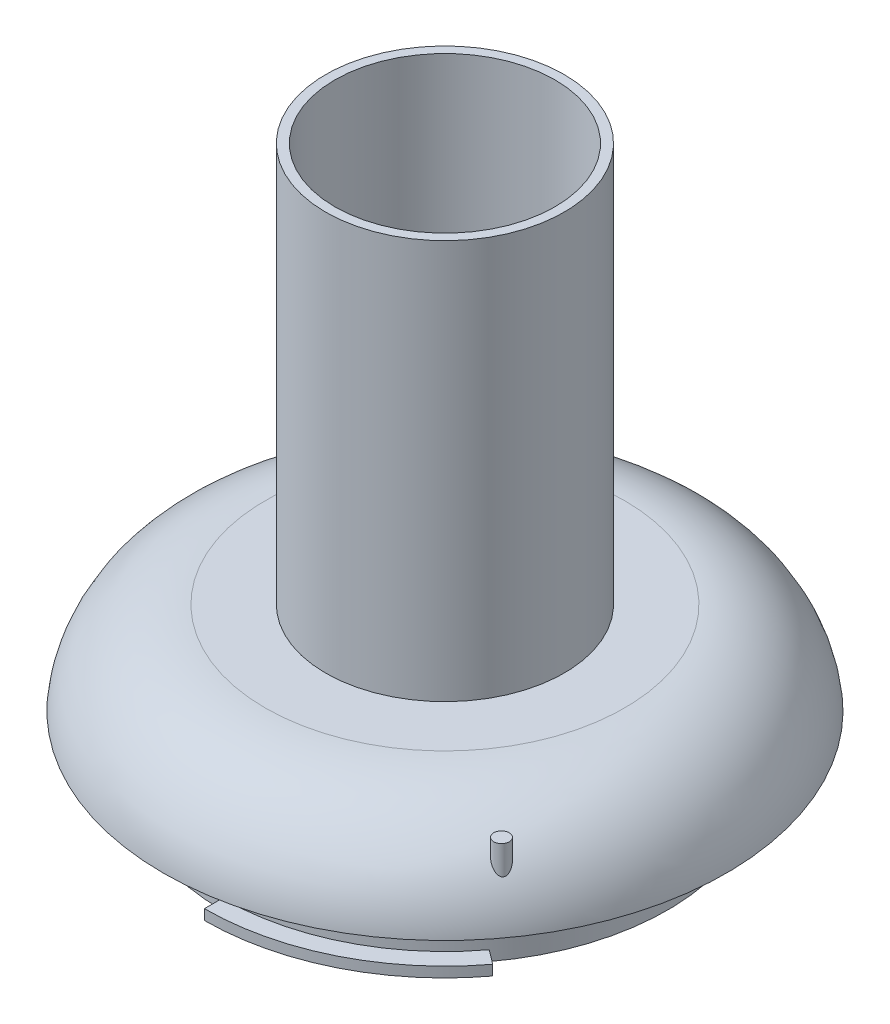
ISO-10303-21;
HEADER;
FILE_DESCRIPTION(('STEP AP214'),'2;1');
FILE_NAME('part.step','',(''),(''),'','','');
FILE_SCHEMA(('AUTOMOTIVE_DESIGN { 1 0 10303 214 1 1 1 1 }'));
ENDSEC;
DATA;
#1=APPLICATION_CONTEXT('core data for automotive mechanical design processes');
#2=APPLICATION_PROTOCOL_DEFINITION('international standard','automotive_design',2000,#1);
#3=PRODUCT_CONTEXT('',#1,'mechanical');
#4=PRODUCT('Part','Part','',(#3));
#5=PRODUCT_RELATED_PRODUCT_CATEGORY('part','',(#4));
#6=PRODUCT_DEFINITION_FORMATION('','',#4);
#7=PRODUCT_DEFINITION_CONTEXT('part definition',#1,'design');
#8=PRODUCT_DEFINITION('design','',#6,#7);
#9=PRODUCT_DEFINITION_SHAPE('','',#8);
#10=(LENGTH_UNIT() NAMED_UNIT(*) SI_UNIT(.MILLI.,.METRE.));
#11=(NAMED_UNIT(*) PLANE_ANGLE_UNIT() SI_UNIT($,.RADIAN.));
#12=(NAMED_UNIT(*) SI_UNIT($,.STERADIAN.) SOLID_ANGLE_UNIT());
#13=UNCERTAINTY_MEASURE_WITH_UNIT(LENGTH_MEASURE(1.E-05),#10,'distance_accuracy_value','');
#14=(GEOMETRIC_REPRESENTATION_CONTEXT(3) GLOBAL_UNCERTAINTY_ASSIGNED_CONTEXT((#13)) GLOBAL_UNIT_ASSIGNED_CONTEXT((#10,
#11,#12)) REPRESENTATION_CONTEXT('',''));
#15=CARTESIAN_POINT('',(0.,0.,0.));
#16=DIRECTION('',(0.,0.,1.));
#17=DIRECTION('',(1.,0.,0.));
#18=AXIS2_PLACEMENT_3D('',#15,#16,#17);
#19=CARTESIAN_POINT('',(0.,0.,0.));
#20=DIRECTION('',(0.,1.,0.));
#21=DIRECTION('',(0.,0.,1.));
#22=AXIS2_PLACEMENT_3D('',#19,#20,#21);
#23=PLANE('',#22);
#24=CARTESIAN_POINT('',(0.,0.,0.));
#25=DIRECTION('',(0.,1.,0.));
#26=DIRECTION('',(0.,0.,1.));
#27=AXIS2_PLACEMENT_3D('',#24,#25,#26);
#28=CIRCLE('',#27,21.75);
#29=CARTESIAN_POINT('',(17.388173548237,0.,13.0657537347216));
#30=VERTEX_POINT('',#29);
#31=CARTESIAN_POINT('',(18.8360525323115,0.,-10.8750000000001));
#32=VERTEX_POINT('',#31);
#33=EDGE_CURVE('E244',#30,#32,#28,.T.);
#34=ORIENTED_EDGE('',*,*,#33,.F.);
#35=DIRECTION('',(0.799456255091356,0.,0.600724309642372));
#36=VECTOR('',#35,1.);
#37=CARTESIAN_POINT('',(17.388173548237,0.,13.0657537347216));
#38=LINE('',#37,#36);
#39=CARTESIAN_POINT('',(18.7872219946469,0.,14.1170212765957));
#40=VERTEX_POINT('',#39);
#41=EDGE_CURVE('E182',#30,#40,#38,.T.);
#42=ORIENTED_EDGE('',*,*,#41,.T.);
#43=CARTESIAN_POINT('',(0.,0.,0.));
#44=DIRECTION('',(0.,-1.,0.));
#45=DIRECTION('',(0.,0.,-1.));
#46=AXIS2_PLACEMENT_3D('',#43,#44,#45);
#47=CIRCLE('',#46,23.5);
#48=CARTESIAN_POINT('',(0.,0.,23.5));
#49=VERTEX_POINT('',#48);
#50=EDGE_CURVE('E204',#40,#49,#47,.T.);
#51=ORIENTED_EDGE('',*,*,#50,.T.);
#52=DIRECTION('',(0.,0.,1.));
#53=VECTOR('',#52,1.);
#54=CARTESIAN_POINT('',(0.,0.,21.75));
#55=LINE('',#54,#53);
#56=CARTESIAN_POINT('',(0.,0.,21.75));
#57=VERTEX_POINT('',#56);
#58=EDGE_CURVE('E193',#57,#49,#55,.T.);
#59=ORIENTED_EDGE('',*,*,#58,.F.);
#60=CARTESIAN_POINT('',(-20.0093614279787,0.,8.52572315082523));
#61=VERTEX_POINT('',#60);
#62=EDGE_CURVE('E239',#61,#57,#28,.T.);
#63=ORIENTED_EDGE('',*,*,#62,.F.);
#64=DIRECTION('',(-0.919970640366838,0.,0.391987271302309));
#65=VECTOR('',#64,1.);
#66=CARTESIAN_POINT('',(-20.0093614279787,0.,8.52572315082523));
#67=LINE('',#66,#65);
#68=CARTESIAN_POINT('',(-21.6193100486207,0.,9.21170087560427));
#69=VERTEX_POINT('',#68);
#70=EDGE_CURVE('E152',#61,#69,#67,.T.);
#71=ORIENTED_EDGE('',*,*,#70,.T.);
#72=CARTESIAN_POINT('',(0.,0.,0.));
#73=DIRECTION('',(0.,-1.,0.));
#74=DIRECTION('',(0.866025403784443,0.,0.499999999999992));
#75=AXIS2_PLACEMENT_3D('',#72,#73,#74);
#76=CIRCLE('',#75,23.5);
#77=CARTESIAN_POINT('',(-20.3515969889344,0.,-11.7499999999998));
#78=VERTEX_POINT('',#77);
#79=EDGE_CURVE('E126',#69,#78,#76,.T.);
#80=ORIENTED_EDGE('',*,*,#79,.T.);
#81=DIRECTION('',(-0.866025403784443,0.,-0.499999999999992));
#82=VECTOR('',#81,1.);
#83=CARTESIAN_POINT('',(-18.8360525323116,0.,-10.8749999999998));
#84=LINE('',#83,#82);
#85=CARTESIAN_POINT('',(-18.8360525323116,0.,-10.8749999999998));
#86=VERTEX_POINT('',#85);
#87=EDGE_CURVE('E143',#86,#78,#84,.T.);
#88=ORIENTED_EDGE('',*,*,#87,.F.);
#89=CARTESIAN_POINT('',(2.62118787974171,0.,-21.5914768855467));
#90=VERTEX_POINT('',#89);
#91=EDGE_CURVE('E246',#90,#86,#28,.T.);
#92=ORIENTED_EDGE('',*,*,#91,.F.);
#93=DIRECTION('',(0.120514385275481,0.,-0.992711580944674));
#94=VECTOR('',#93,1.);
#95=CARTESIAN_POINT('',(2.62118787974171,0.,-21.5914768855467));
#96=LINE('',#95,#94);
#97=CARTESIAN_POINT('',(2.8320880539738,0.,-23.3287221521998));
#98=VERTEX_POINT('',#97);
#99=EDGE_CURVE('E156',#90,#98,#96,.T.);
#100=ORIENTED_EDGE('',*,*,#99,.T.);
#101=CARTESIAN_POINT('',(0.,0.,0.));
#102=DIRECTION('',(0.,-1.,0.));
#103=DIRECTION('',(-0.866025403784436,0.,0.500000000000004));
#104=AXIS2_PLACEMENT_3D('',#101,#102,#103);
#105=CIRCLE('',#104,23.5);
#106=CARTESIAN_POINT('',(20.3515969889343,0.,-11.7500000000001));
#107=VERTEX_POINT('',#106);
#108=EDGE_CURVE('E174',#98,#107,#105,.T.);
#109=ORIENTED_EDGE('',*,*,#108,.T.);
#110=DIRECTION('',(0.866025403784436,0.,-0.500000000000004));
#111=VECTOR('',#110,1.);
#112=CARTESIAN_POINT('',(18.8360525323115,0.,-10.8750000000001));
#113=LINE('',#112,#111);
#114=EDGE_CURVE('E163',#32,#107,#113,.T.);
#115=ORIENTED_EDGE('',*,*,#114,.F.);
#116=EDGE_LOOP('',(#34,#42,#51,#59,#63,#71,#80,#88,#92,#100,#109,#115));
#117=FACE_BOUND('',#116,.T.);
#118=CARTESIAN_POINT('',(0.,0.,0.));
#119=DIRECTION('',(0.,-1.,0.));
#120=DIRECTION('',(0.,0.,-1.));
#121=AXIS2_PLACEMENT_3D('',#118,#119,#120);
#122=CIRCLE('',#121,20.);
#123=CARTESIAN_POINT('',(0.,0.,-20.));
#124=VERTEX_POINT('',#123);
#125=EDGE_CURVE('E212',#124,#124,#122,.T.);
#126=ORIENTED_EDGE('',*,*,#125,.F.);
#127=EDGE_LOOP('',(#126));
#128=FACE_BOUND('',#127,.T.);
#129=ADVANCED_FACE('F33',(#117,#128),#23,.F.);
#130=CARTESIAN_POINT('',(0.,5.,0.));
#131=DIRECTION('',(0.,-1.,0.));
#132=DIRECTION('',(0.,0.,-1.));
#133=AXIS2_PLACEMENT_3D('',#130,#131,#132);
#134=CYLINDRICAL_SURFACE('',#133,21.75);
#135=CARTESIAN_POINT('',(0.,1.,0.));
#136=DIRECTION('',(0.,-1.,0.));
#137=DIRECTION('',(0.866025403784443,0.,0.499999999999992));
#138=AXIS2_PLACEMENT_3D('',#135,#136,#137);
#139=CIRCLE('',#138,21.75);
#140=CARTESIAN_POINT('',(-20.0093614279787,1.,8.52572315082523));
#141=VERTEX_POINT('',#140);
#142=CARTESIAN_POINT('',(-18.8360525323116,1.,-10.8749999999998));
#143=VERTEX_POINT('',#142);
#144=EDGE_CURVE('E52',#141,#143,#139,.T.);
#145=ORIENTED_EDGE('',*,*,#144,.F.);
#146=DIRECTION('',(0.,-1.,0.));
#147=VECTOR('',#146,1.);
#148=CARTESIAN_POINT('',(-20.0093614279787,1.,8.52572315082523));
#149=LINE('',#148,#147);
#150=EDGE_CURVE('E142',#141,#61,#149,.T.);
#151=ORIENTED_EDGE('',*,*,#150,.T.);
#152=ORIENTED_EDGE('',*,*,#62,.T.);
#153=DIRECTION('',(0.,-1.,0.));
#154=VECTOR('',#153,1.);
#155=CARTESIAN_POINT('',(0.,1.,21.75));
#156=LINE('',#155,#154);
#157=CARTESIAN_POINT('',(0.,1.,21.75));
#158=VERTEX_POINT('',#157);
#159=EDGE_CURVE('E213',#158,#57,#156,.T.);
#160=ORIENTED_EDGE('',*,*,#159,.F.);
#161=CARTESIAN_POINT('',(0.,1.,0.));
#162=DIRECTION('',(0.,-1.,0.));
#163=DIRECTION('',(0.,0.,-1.));
#164=AXIS2_PLACEMENT_3D('',#161,#162,#163);
#165=CIRCLE('',#164,21.75);
#166=CARTESIAN_POINT('',(17.388173548237,1.,13.0657537347216));
#167=VERTEX_POINT('',#166);
#168=EDGE_CURVE('E198',#167,#158,#165,.T.);
#169=ORIENTED_EDGE('',*,*,#168,.F.);
#170=DIRECTION('',(0.,-1.,0.));
#171=VECTOR('',#170,1.);
#172=CARTESIAN_POINT('',(17.388173548237,1.,13.0657537347216));
#173=LINE('',#172,#171);
#174=EDGE_CURVE('E209',#167,#30,#173,.T.);
#175=ORIENTED_EDGE('',*,*,#174,.T.);
#176=ORIENTED_EDGE('',*,*,#33,.T.);
#177=DIRECTION('',(0.,-1.,0.));
#178=VECTOR('',#177,1.);
#179=CARTESIAN_POINT('',(18.8360525323115,1.,-10.8750000000001));
#180=LINE('',#179,#178);
#181=CARTESIAN_POINT('',(18.8360525323115,1.,-10.8750000000001));
#182=VERTEX_POINT('',#181);
#183=EDGE_CURVE('E183',#182,#32,#180,.T.);
#184=ORIENTED_EDGE('',*,*,#183,.F.);
#185=CARTESIAN_POINT('',(0.,1.,0.));
#186=DIRECTION('',(0.,-1.,0.));
#187=DIRECTION('',(-0.866025403784436,0.,0.500000000000004));
#188=AXIS2_PLACEMENT_3D('',#185,#186,#187);
#189=CIRCLE('',#188,21.75);
#190=CARTESIAN_POINT('',(2.62118787974171,1.,-21.5914768855466));
#191=VERTEX_POINT('',#190);
#192=EDGE_CURVE('E168',#191,#182,#189,.T.);
#193=ORIENTED_EDGE('',*,*,#192,.F.);
#194=DIRECTION('',(0.,-1.,0.));
#195=VECTOR('',#194,1.);
#196=CARTESIAN_POINT('',(2.62118787974171,1.,-21.5914768855467));
#197=LINE('',#196,#195);
#198=EDGE_CURVE('E179',#191,#90,#197,.T.);
#199=ORIENTED_EDGE('',*,*,#198,.T.);
#200=ORIENTED_EDGE('',*,*,#91,.T.);
#201=DIRECTION('',(0.,-1.,0.));
#202=VECTOR('',#201,1.);
#203=CARTESIAN_POINT('',(-18.8360525323116,1.,-10.8749999999998));
#204=LINE('',#203,#202);
#205=EDGE_CURVE('E48',#143,#86,#204,.T.);
#206=ORIENTED_EDGE('',*,*,#205,.F.);
#207=EDGE_LOOP('',(#145,#151,#152,#160,#169,#175,#176,#184,#193,#199,#200,#206));
#208=FACE_BOUND('',#207,.T.);
#209=CARTESIAN_POINT('',(0.,5.,0.));
#210=DIRECTION('',(0.,1.,0.));
#211=DIRECTION('',(0.,0.,1.));
#212=AXIS2_PLACEMENT_3D('',#209,#210,#211);
#213=CIRCLE('',#212,21.75);
#214=CARTESIAN_POINT('',(0.,5.,21.75));
#215=VERTEX_POINT('',#214);
#216=EDGE_CURVE('E240',#215,#215,#213,.T.);
#217=ORIENTED_EDGE('',*,*,#216,.F.);
#218=EDGE_LOOP('',(#217));
#219=FACE_BOUND('',#218,.T.);
#220=ADVANCED_FACE('F331',(#208,#219),#134,.T.);
#221=CARTESIAN_POINT('',(0.,5.,0.));
#222=DIRECTION('',(0.,1.,0.));
#223=DIRECTION('',(0.,0.,1.));
#224=AXIS2_PLACEMENT_3D('',#221,#222,#223);
#225=PLANE('',#224);
#226=CARTESIAN_POINT('',(0.,5.,0.));
#227=DIRECTION('',(0.,1.,0.));
#228=DIRECTION('',(0.,0.,1.));
#229=AXIS2_PLACEMENT_3D('',#226,#227,#228);
#230=CIRCLE('',#229,23.5);
#231=CARTESIAN_POINT('',(0.,5.,23.5));
#232=VERTEX_POINT('',#231);
#233=EDGE_CURVE('E236',#232,#232,#230,.T.);
#234=ORIENTED_EDGE('',*,*,#233,.F.);
#235=EDGE_LOOP('',(#234));
#236=FACE_BOUND('',#235,.T.);
#237=ORIENTED_EDGE('',*,*,#216,.T.);
#238=EDGE_LOOP('',(#237));
#239=FACE_BOUND('',#238,.T.);
#240=ADVANCED_FACE('F327',(#236,#239),#225,.F.);
#241=CARTESIAN_POINT('',(0.,6.,0.));
#242=DIRECTION('',(0.,1.,0.));
#243=DIRECTION('',(0.,0.,1.));
#244=AXIS2_PLACEMENT_3D('',#241,#242,#243);
#245=PLANE('',#244);
#246=CARTESIAN_POINT('',(0.,6.,0.));
#247=DIRECTION('',(0.,1.,0.));
#248=DIRECTION('',(0.,0.,1.));
#249=AXIS2_PLACEMENT_3D('',#246,#247,#248);
#250=CIRCLE('',#249,25.9750868534163);
#251=CARTESIAN_POINT('',(0.,6.,25.9750868534163));
#252=VERTEX_POINT('',#251);
#253=EDGE_CURVE('E11',#252,#252,#250,.T.);
#254=ORIENTED_EDGE('',*,*,#253,.T.);
#255=EDGE_LOOP('',(#254));
#256=FACE_BOUND('',#255,.T.);
#257=CARTESIAN_POINT('',(0.,6.,0.));
#258=DIRECTION('',(0.,1.,0.));
#259=DIRECTION('',(0.,0.,1.));
#260=AXIS2_PLACEMENT_3D('',#257,#258,#259);
#261=CIRCLE('',#260,27.5);
#262=CARTESIAN_POINT('',(0.,6.,27.5));
#263=VERTEX_POINT('',#262);
#264=EDGE_CURVE('E233',#263,#263,#261,.T.);
#265=ORIENTED_EDGE('',*,*,#264,.F.);
#266=EDGE_LOOP('',(#265));
#267=FACE_BOUND('',#266,.T.);
#268=ADVANCED_FACE('F323',(#256,#267),#245,.F.);
#269=CARTESIAN_POINT('',(0.,15.,0.));
#270=DIRECTION('',(0.,1.,0.));
#271=DIRECTION('',(0.,0.,1.));
#272=AXIS2_PLACEMENT_3D('',#269,#270,#271);
#273=PLANE('',#272);
#274=CARTESIAN_POINT('',(0.,15.,0.));
#275=DIRECTION('',(0.,1.,0.));
#276=DIRECTION('',(0.,0.,1.));
#277=AXIS2_PLACEMENT_3D('',#274,#275,#276);
#278=CIRCLE('',#277,17.5501256289338);
#279=CARTESIAN_POINT('',(0.,15.,17.5501256289338));
#280=VERTEX_POINT('',#279);
#281=EDGE_CURVE('E243',#280,#280,#278,.T.);
#282=ORIENTED_EDGE('',*,*,#281,.T.);
#283=EDGE_LOOP('',(#282));
#284=FACE_BOUND('',#283,.T.);
#285=CARTESIAN_POINT('',(0.,15.,0.));
#286=DIRECTION('',(0.,1.,0.));
#287=DIRECTION('',(0.,0.,1.));
#288=AXIS2_PLACEMENT_3D('',#285,#286,#287);
#289=CIRCLE('',#288,11.65);
#290=CARTESIAN_POINT('',(0.,15.,11.65));
#291=VERTEX_POINT('',#290);
#292=EDGE_CURVE('E230',#291,#291,#289,.T.);
#293=ORIENTED_EDGE('',*,*,#292,.F.);
#294=EDGE_LOOP('',(#293));
#295=FACE_BOUND('',#294,.T.);
#296=ADVANCED_FACE('F316',(#284,#295),#273,.T.);
#297=CARTESIAN_POINT('',(0.,54.,0.));
#298=DIRECTION('',(0.,1.,0.));
#299=DIRECTION('',(0.,0.,1.));
#300=AXIS2_PLACEMENT_3D('',#297,#298,#299);
#301=PLANE('',#300);
#302=CARTESIAN_POINT('',(0.,54.,0.));
#303=DIRECTION('',(0.,1.,0.));
#304=DIRECTION('',(0.,0.,1.));
#305=AXIS2_PLACEMENT_3D('',#302,#303,#304);
#306=CIRCLE('',#305,11.65);
#307=CARTESIAN_POINT('',(0.,54.,11.65));
#308=VERTEX_POINT('',#307);
#309=EDGE_CURVE('E225',#308,#308,#306,.T.);
#310=ORIENTED_EDGE('',*,*,#309,.T.);
#311=EDGE_LOOP('',(#310));
#312=FACE_BOUND('',#311,.T.);
#313=CARTESIAN_POINT('',(0.,54.,0.));
#314=DIRECTION('',(0.,1.,0.));
#315=DIRECTION('',(0.,0.,1.));
#316=AXIS2_PLACEMENT_3D('',#313,#314,#315);
#317=CIRCLE('',#316,10.75);
#318=CARTESIAN_POINT('',(0.,54.,10.75));
#319=VERTEX_POINT('',#318);
#320=EDGE_CURVE('E222',#319,#319,#317,.T.);
#321=ORIENTED_EDGE('',*,*,#320,.F.);
#322=EDGE_LOOP('',(#321));
#323=FACE_BOUND('',#322,.T.);
#324=ADVANCED_FACE('F313',(#312,#323),#301,.T.);
#325=CARTESIAN_POINT('',(0.,54.,0.));
#326=DIRECTION('',(0.,-1.,0.));
#327=DIRECTION('',(0.,0.,-1.));
#328=AXIS2_PLACEMENT_3D('',#325,#326,#327);
#329=CYLINDRICAL_SURFACE('',#328,11.65);
#330=ORIENTED_EDGE('',*,*,#292,.T.);
#331=EDGE_LOOP('',(#330));
#332=FACE_BOUND('',#331,.T.);
#333=ORIENTED_EDGE('',*,*,#309,.F.);
#334=EDGE_LOOP('',(#333));
#335=FACE_BOUND('',#334,.T.);
#336=ADVANCED_FACE('F311',(#332,#335),#329,.T.);
#337=CARTESIAN_POINT('',(0.,54.,0.));
#338=DIRECTION('',(0.,-1.,0.));
#339=DIRECTION('',(0.,0.,-1.));
#340=AXIS2_PLACEMENT_3D('',#337,#338,#339);
#341=CYLINDRICAL_SURFACE('',#340,10.75);
#342=ORIENTED_EDGE('',*,*,#320,.T.);
#343=EDGE_LOOP('',(#342));
#344=FACE_BOUND('',#343,.T.);
#345=CARTESIAN_POINT('',(0.,14.,0.));
#346=DIRECTION('',(0.,1.,0.));
#347=DIRECTION('',(0.,0.,1.));
#348=AXIS2_PLACEMENT_3D('',#345,#346,#347);
#349=CIRCLE('',#348,10.75);
#350=CARTESIAN_POINT('',(0.,14.,10.75));
#351=VERTEX_POINT('',#350);
#352=EDGE_CURVE('E221',#351,#351,#349,.T.);
#353=ORIENTED_EDGE('',*,*,#352,.F.);
#354=EDGE_LOOP('',(#353));
#355=FACE_BOUND('',#354,.T.);
#356=ADVANCED_FACE('F307',(#344,#355),#341,.F.);
#357=CARTESIAN_POINT('',(0.,14.,0.));
#358=DIRECTION('',(0.,-1.,0.));
#359=DIRECTION('',(0.,0.,-1.));
#360=AXIS2_PLACEMENT_3D('',#357,#358,#359);
#361=CONICAL_SURFACE('',#360,10.75,0.583870395662115);
#362=ORIENTED_EDGE('',*,*,#125,.T.);
#363=EDGE_LOOP('',(#362));
#364=FACE_BOUND('',#363,.T.);
#365=ORIENTED_EDGE('',*,*,#352,.T.);
#366=EDGE_LOOP('',(#365));
#367=FACE_BOUND('',#366,.T.);
#368=ADVANCED_FACE('F303',(#364,#367),#361,.F.);
#369=CARTESIAN_POINT('',(17.388173548237,1.,13.0657537347216));
#370=DIRECTION('',(0.600724309642372,0.,-0.799456255091356));
#371=DIRECTION('',(-0.799456255091356,0.,-0.600724309642372));
#372=AXIS2_PLACEMENT_3D('',#369,#370,#371);
#373=PLANE('',#372);
#374=ORIENTED_EDGE('',*,*,#41,.F.);
#375=ORIENTED_EDGE('',*,*,#174,.F.);
#376=DIRECTION('',(0.799456255091356,0.,0.600724309642372));
#377=VECTOR('',#376,1.);
#378=CARTESIAN_POINT('',(17.388173548237,1.,13.0657537347216));
#379=LINE('',#378,#377);
#380=CARTESIAN_POINT('',(18.7872219946469,1.,14.1170212765957));
#381=VERTEX_POINT('',#380);
#382=EDGE_CURVE('E189',#167,#381,#379,.T.);
#383=ORIENTED_EDGE('',*,*,#382,.T.);
#384=DIRECTION('',(0.,-1.,0.));
#385=VECTOR('',#384,1.);
#386=CARTESIAN_POINT('',(18.7872219946469,1.,14.1170212765957));
#387=LINE('',#386,#385);
#388=EDGE_CURVE('E201',#381,#40,#387,.T.);
#389=ORIENTED_EDGE('',*,*,#388,.T.);
#390=EDGE_LOOP('',(#374,#375,#383,#389));
#391=FACE_BOUND('',#390,.T.);
#392=ADVANCED_FACE('F296',(#391),#373,.T.);
#393=CARTESIAN_POINT('',(0.,1.,21.75));
#394=DIRECTION('',(1.,0.,0.));
#395=DIRECTION('',(0.,0.,-1.));
#396=AXIS2_PLACEMENT_3D('',#393,#394,#395);
#397=PLANE('',#396);
#398=ORIENTED_EDGE('',*,*,#58,.T.);
#399=DIRECTION('',(0.,-1.,0.));
#400=VECTOR('',#399,1.);
#401=CARTESIAN_POINT('',(0.,1.,23.5));
#402=LINE('',#401,#400);
#403=CARTESIAN_POINT('',(0.,1.,23.5));
#404=VERTEX_POINT('',#403);
#405=EDGE_CURVE('E216',#404,#49,#402,.T.);
#406=ORIENTED_EDGE('',*,*,#405,.F.);
#407=DIRECTION('',(0.,0.,1.));
#408=VECTOR('',#407,1.);
#409=CARTESIAN_POINT('',(0.,1.,21.75));
#410=LINE('',#409,#408);
#411=EDGE_CURVE('E196',#158,#404,#410,.T.);
#412=ORIENTED_EDGE('',*,*,#411,.F.);
#413=ORIENTED_EDGE('',*,*,#159,.T.);
#414=EDGE_LOOP('',(#398,#406,#412,#413));
#415=FACE_BOUND('',#414,.T.);
#416=ADVANCED_FACE('F293',(#415),#397,.F.);
#417=CARTESIAN_POINT('',(0.,1.,0.));
#418=DIRECTION('',(0.,-1.,0.));
#419=DIRECTION('',(0.,0.,-1.));
#420=AXIS2_PLACEMENT_3D('',#417,#418,#419);
#421=CYLINDRICAL_SURFACE('',#420,23.5);
#422=ORIENTED_EDGE('',*,*,#50,.F.);
#423=ORIENTED_EDGE('',*,*,#388,.F.);
#424=CARTESIAN_POINT('',(0.,1.,0.));
#425=DIRECTION('',(0.,-1.,0.));
#426=DIRECTION('',(0.,0.,-1.));
#427=AXIS2_PLACEMENT_3D('',#424,#425,#426);
#428=CIRCLE('',#427,23.5);
#429=EDGE_CURVE('E192',#381,#404,#428,.T.);
#430=ORIENTED_EDGE('',*,*,#429,.T.);
#431=ORIENTED_EDGE('',*,*,#405,.T.);
#432=EDGE_LOOP('',(#422,#423,#430,#431));
#433=FACE_BOUND('',#432,.T.);
#434=ADVANCED_FACE('F291',(#433),#421,.T.);
#435=CARTESIAN_POINT('',(0.,1.,0.));
#436=DIRECTION('',(0.,-1.,0.));
#437=DIRECTION('',(0.,0.,-1.));
#438=AXIS2_PLACEMENT_3D('',#435,#436,#437);
#439=PLANE('',#438);
#440=ORIENTED_EDGE('',*,*,#382,.F.);
#441=ORIENTED_EDGE('',*,*,#168,.T.);
#442=ORIENTED_EDGE('',*,*,#411,.T.);
#443=ORIENTED_EDGE('',*,*,#429,.F.);
#444=EDGE_LOOP('',(#440,#441,#442,#443));
#445=FACE_BOUND('',#444,.T.);
#446=ADVANCED_FACE('F287',(#445),#439,.F.);
#447=CARTESIAN_POINT('',(2.62118787974171,1.,-21.5914768855467));
#448=DIRECTION('',(-0.992711580944673,0.,-0.120514385275481));
#449=DIRECTION('',(-0.120514385275481,0.,0.992711580944673));
#450=AXIS2_PLACEMENT_3D('',#447,#448,#449);
#451=PLANE('',#450);
#452=ORIENTED_EDGE('',*,*,#99,.F.);
#453=ORIENTED_EDGE('',*,*,#198,.F.);
#454=DIRECTION('',(0.120514385275481,0.,-0.992711580944674));
#455=VECTOR('',#454,1.);
#456=CARTESIAN_POINT('',(2.62118787974171,1.,-21.5914768855467));
#457=LINE('',#456,#455);
#458=CARTESIAN_POINT('',(2.8320880539738,1.,-23.3287221521998));
#459=VERTEX_POINT('',#458);
#460=EDGE_CURVE('E159',#191,#459,#457,.T.);
#461=ORIENTED_EDGE('',*,*,#460,.T.);
#462=DIRECTION('',(0.,-1.,0.));
#463=VECTOR('',#462,1.);
#464=CARTESIAN_POINT('',(2.8320880539738,1.,-23.3287221521998));
#465=LINE('',#464,#463);
#466=EDGE_CURVE('E171',#459,#98,#465,.T.);
#467=ORIENTED_EDGE('',*,*,#466,.T.);
#468=EDGE_LOOP('',(#452,#453,#461,#467));
#469=FACE_BOUND('',#468,.T.);
#470=ADVANCED_FACE('F280',(#469),#451,.T.);
#471=CARTESIAN_POINT('',(18.8360525323115,1.,-10.8750000000001));
#472=DIRECTION('',(-0.500000000000004,0.,-0.866025403784436));
#473=DIRECTION('',(-0.866025403784436,0.,0.500000000000004));
#474=AXIS2_PLACEMENT_3D('',#471,#472,#473);
#475=PLANE('',#474);
#476=ORIENTED_EDGE('',*,*,#114,.T.);
#477=DIRECTION('',(0.,-1.,0.));
#478=VECTOR('',#477,1.);
#479=CARTESIAN_POINT('',(20.3515969889343,1.,-11.7500000000001));
#480=LINE('',#479,#478);
#481=CARTESIAN_POINT('',(20.3515969889343,1.,-11.7500000000001));
#482=VERTEX_POINT('',#481);
#483=EDGE_CURVE('E186',#482,#107,#480,.T.);
#484=ORIENTED_EDGE('',*,*,#483,.F.);
#485=DIRECTION('',(0.866025403784436,0.,-0.500000000000004));
#486=VECTOR('',#485,1.);
#487=CARTESIAN_POINT('',(18.8360525323115,1.,-10.8750000000001));
#488=LINE('',#487,#486);
#489=EDGE_CURVE('E166',#182,#482,#488,.T.);
#490=ORIENTED_EDGE('',*,*,#489,.F.);
#491=ORIENTED_EDGE('',*,*,#183,.T.);
#492=EDGE_LOOP('',(#476,#484,#490,#491));
#493=FACE_BOUND('',#492,.T.);
#494=ADVANCED_FACE('F277',(#493),#475,.F.);
#495=CARTESIAN_POINT('',(0.,1.,0.));
#496=DIRECTION('',(0.,-1.,0.));
#497=DIRECTION('',(0.,0.,-1.));
#498=AXIS2_PLACEMENT_3D('',#495,#496,#497);
#499=CYLINDRICAL_SURFACE('',#498,23.5);
#500=ORIENTED_EDGE('',*,*,#108,.F.);
#501=ORIENTED_EDGE('',*,*,#466,.F.);
#502=CARTESIAN_POINT('',(0.,1.,0.));
#503=DIRECTION('',(0.,-1.,0.));
#504=DIRECTION('',(-0.866025403784436,0.,0.500000000000004));
#505=AXIS2_PLACEMENT_3D('',#502,#503,#504);
#506=CIRCLE('',#505,23.5);
#507=EDGE_CURVE('E162',#459,#482,#506,.T.);
#508=ORIENTED_EDGE('',*,*,#507,.T.);
#509=ORIENTED_EDGE('',*,*,#483,.T.);
#510=EDGE_LOOP('',(#500,#501,#508,#509));
#511=FACE_BOUND('',#510,.T.);
#512=ADVANCED_FACE('F275',(#511),#499,.T.);
#513=CARTESIAN_POINT('',(0.,1.,0.));
#514=DIRECTION('',(0.,-1.,0.));
#515=DIRECTION('',(-0.866025403784436,0.,0.500000000000004));
#516=AXIS2_PLACEMENT_3D('',#513,#514,#515);
#517=PLANE('',#516);
#518=ORIENTED_EDGE('',*,*,#460,.F.);
#519=ORIENTED_EDGE('',*,*,#192,.T.);
#520=ORIENTED_EDGE('',*,*,#489,.T.);
#521=ORIENTED_EDGE('',*,*,#507,.F.);
#522=EDGE_LOOP('',(#518,#519,#520,#521));
#523=FACE_BOUND('',#522,.T.);
#524=ADVANCED_FACE('F272',(#523),#517,.F.);
#525=CARTESIAN_POINT('',(-20.0093614279787,1.,8.52572315082523));
#526=DIRECTION('',(0.391987271302309,0.,0.919970640366838));
#527=DIRECTION('',(0.919970640366838,0.,-0.391987271302309));
#528=AXIS2_PLACEMENT_3D('',#525,#526,#527);
#529=PLANE('',#528);
#530=ORIENTED_EDGE('',*,*,#70,.F.);
#531=ORIENTED_EDGE('',*,*,#150,.F.);
#532=DIRECTION('',(-0.919970640366838,0.,0.391987271302309));
#533=VECTOR('',#532,1.);
#534=CARTESIAN_POINT('',(-20.0093614279787,1.,8.52572315082523));
#535=LINE('',#534,#533);
#536=CARTESIAN_POINT('',(-21.6193100486207,1.,9.21170087560427));
#537=VERTEX_POINT('',#536);
#538=EDGE_CURVE('E136',#141,#537,#535,.T.);
#539=ORIENTED_EDGE('',*,*,#538,.T.);
#540=DIRECTION('',(0.,-1.,0.));
#541=VECTOR('',#540,1.);
#542=CARTESIAN_POINT('',(-21.6193100486207,1.,9.21170087560427));
#543=LINE('',#542,#541);
#544=EDGE_CURVE('E121',#537,#69,#543,.T.);
#545=ORIENTED_EDGE('',*,*,#544,.T.);
#546=EDGE_LOOP('',(#530,#531,#539,#545));
#547=FACE_BOUND('',#546,.T.);
#548=ADVANCED_FACE('F141',(#547),#529,.T.);
#549=CARTESIAN_POINT('',(-18.8360525323116,1.,-10.8749999999998));
#550=DIRECTION('',(-0.499999999999992,0.,0.866025403784443));
#551=DIRECTION('',(0.866025403784443,0.,0.499999999999992));
#552=AXIS2_PLACEMENT_3D('',#549,#550,#551);
#553=PLANE('',#552);
#554=ORIENTED_EDGE('',*,*,#87,.T.);
#555=DIRECTION('',(0.,-1.,0.));
#556=VECTOR('',#555,1.);
#557=CARTESIAN_POINT('',(-20.3515969889344,1.,-11.7499999999998));
#558=LINE('',#557,#556);
#559=CARTESIAN_POINT('',(-20.3515969889344,1.,-11.7499999999998));
#560=VERTEX_POINT('',#559);
#561=EDGE_CURVE('E131',#560,#78,#558,.T.);
#562=ORIENTED_EDGE('',*,*,#561,.F.);
#563=DIRECTION('',(-0.866025403784443,0.,-0.499999999999992));
#564=VECTOR('',#563,1.);
#565=CARTESIAN_POINT('',(-18.8360525323116,1.,-10.8749999999998));
#566=LINE('',#565,#564);
#567=EDGE_CURVE('E138',#143,#560,#566,.T.);
#568=ORIENTED_EDGE('',*,*,#567,.F.);
#569=ORIENTED_EDGE('',*,*,#205,.T.);
#570=EDGE_LOOP('',(#554,#562,#568,#569));
#571=FACE_BOUND('',#570,.T.);
#572=ADVANCED_FACE('F264',(#571),#553,.F.);
#573=CARTESIAN_POINT('',(0.,1.,0.));
#574=DIRECTION('',(0.,-1.,0.));
#575=DIRECTION('',(0.,0.,-1.));
#576=AXIS2_PLACEMENT_3D('',#573,#574,#575);
#577=CYLINDRICAL_SURFACE('',#576,23.5);
#578=ORIENTED_EDGE('',*,*,#79,.F.);
#579=ORIENTED_EDGE('',*,*,#544,.F.);
#580=CARTESIAN_POINT('',(0.,1.,0.));
#581=DIRECTION('',(0.,-1.,0.));
#582=DIRECTION('',(0.866025403784443,0.,0.499999999999992));
#583=AXIS2_PLACEMENT_3D('',#580,#581,#582);
#584=CIRCLE('',#583,23.5);
#585=EDGE_CURVE('E124',#537,#560,#584,.T.);
#586=ORIENTED_EDGE('',*,*,#585,.T.);
#587=ORIENTED_EDGE('',*,*,#561,.T.);
#588=EDGE_LOOP('',(#578,#579,#586,#587));
#589=FACE_BOUND('',#588,.T.);
#590=ADVANCED_FACE('F123',(#589),#577,.T.);
#591=CARTESIAN_POINT('',(0.,1.,0.));
#592=DIRECTION('',(0.,-1.,0.));
#593=DIRECTION('',(0.866025403784443,0.,0.499999999999992));
#594=AXIS2_PLACEMENT_3D('',#591,#592,#593);
#595=PLANE('',#594);
#596=ORIENTED_EDGE('',*,*,#538,.F.);
#597=ORIENTED_EDGE('',*,*,#144,.T.);
#598=ORIENTED_EDGE('',*,*,#567,.T.);
#599=ORIENTED_EDGE('',*,*,#585,.F.);
#600=EDGE_LOOP('',(#596,#597,#598,#599));
#601=FACE_BOUND('',#600,.T.);
#602=ADVANCED_FACE('F135',(#601),#595,.F.);
#603=CARTESIAN_POINT('',(0.,5.,0.));
#604=DIRECTION('',(0.,-1.,0.));
#605=DIRECTION('',(0.,0.,-1.));
#606=AXIS2_PLACEMENT_3D('',#603,#604,#605);
#607=TOROIDAL_SURFACE('',#606,17.5501256289338,10.);
#608=CARTESIAN_POINT('',(21.0768181222158,10.1744467922918,15.4064417014305));
#609=CARTESIAN_POINT('',(21.0912077659419,10.1737528292218,15.3874670861198));
#610=CARTESIAN_POINT('',(21.1047397303926,10.1748650474741,15.3677602371269));
#611=CARTESIAN_POINT('',(21.1296913977157,10.1805926192168,15.3275324124173));
#612=CARTESIAN_POINT('',(21.1411091118774,10.1852112503048,15.3070106920236));
#613=CARTESIAN_POINT('',(21.1616183578134,10.1974689091287,15.2659218224272));
#614=CARTESIAN_POINT('',(21.1707252922235,10.2050870246966,15.2453559479495));
#615=CARTESIAN_POINT('',(21.1867965633632,10.2227885313115,15.2044700899759));
#616=CARTESIAN_POINT('',(21.1937600515004,10.2328728959208,15.1841502069188));
#617=CARTESIAN_POINT('',(21.2100381930597,10.2629142782316,15.1295908181323));
#618=CARTESIAN_POINT('',(21.2174532193617,10.2847623826082,15.0958282583565));
#619=CARTESIAN_POINT('',(21.2276247310838,10.3321394294531,15.0302270183356));
#620=CARTESIAN_POINT('',(21.2303651865311,10.3576807131175,14.9983953177079));
#621=CARTESIAN_POINT('',(21.232686618994,10.4299998088187,14.9148993525705));
#622=CARTESIAN_POINT('',(21.2286685886243,10.4790346933232,14.8651082053971));
#623=CARTESIAN_POINT('',(21.2124777752966,10.5805059039861,14.7706734291684));
#624=CARTESIAN_POINT('',(21.2002883432227,10.6329489768782,14.7260405280788));
#625=CARTESIAN_POINT('',(21.1727739352177,10.7273019292242,14.6512443905707));
#626=CARTESIAN_POINT('',(21.1588169263657,10.7688571389102,14.6201155801399));
#627=CARTESIAN_POINT('',(21.1272991318019,10.8525513260739,14.5605814405136));
#628=CARTESIAN_POINT('',(21.1097365120173,10.894690590431,14.5321775082188));
#629=CARTESIAN_POINT('',(21.0519416355049,11.0216086208627,14.4509578386725));
#630=CARTESIAN_POINT('',(21.006627917052,11.1068022619533,14.4022006241642));
#631=CARTESIAN_POINT('',(20.9289222511179,11.2341265389294,14.338026129307));
#632=CARTESIAN_POINT('',(20.9011174105753,11.2768530010132,14.317996797442));
#633=CARTESIAN_POINT('',(20.8422947221984,11.3616716446008,14.2814915773853));
#634=CARTESIAN_POINT('',(20.811275657331,11.4037635788863,14.2650170425123));
#635=CARTESIAN_POINT('',(20.7462206253224,11.4867437603282,14.2361947682741));
#636=CARTESIAN_POINT('',(20.7121970639714,11.5276361066584,14.2238309789219));
#637=CARTESIAN_POINT('',(20.6411352978378,11.607884314849,14.2038238659238));
#638=CARTESIAN_POINT('',(20.6041004748285,11.6472418288287,14.1961753275163));
#639=CARTESIAN_POINT('',(20.5275565831899,11.7234207375247,14.186518710177));
#640=CARTESIAN_POINT('',(20.4880774945085,11.760264378802,14.1844523891076));
#641=CARTESIAN_POINT('',(20.4066783456689,11.8309469776823,14.1869165929202));
#642=CARTESIAN_POINT('',(20.3647609315204,11.8647890953351,14.1914400903354));
#643=CARTESIAN_POINT('',(20.2877633690297,11.9218605045007,14.2067415090956));
#644=CARTESIAN_POINT('',(20.2529804128139,11.9458621933068,14.2160974364257));
#645=CARTESIAN_POINT('',(20.1830892280201,11.9901425990327,14.2406642918307));
#646=CARTESIAN_POINT('',(20.1479815365481,12.010426597936,14.2558668165102));
#647=CARTESIAN_POINT('',(20.0861751826211,12.042211129746,14.288696812409));
#648=CARTESIAN_POINT('',(20.0593076534452,12.0546625105467,14.3050786267869));
#649=CARTESIAN_POINT('',(20.0069016031245,12.0759322608507,14.3418644218866));
#650=CARTESIAN_POINT('',(19.9813622364608,12.0847529670306,14.3622658031005));
#651=CARTESIAN_POINT('',(19.9323965729798,12.0982369436896,14.4070063489627));
#652=CARTESIAN_POINT('',(19.9089851890905,12.1028726453578,14.4313703957523));
#653=CARTESIAN_POINT('',(19.8654517763398,12.107520884581,14.4832723726229));
#654=CARTESIAN_POINT('',(19.8453283653036,12.1075353697941,14.5108089607094));
#655=CARTESIAN_POINT('',(19.811009627042,12.1031915471939,14.5650257811008));
#656=CARTESIAN_POINT('',(19.7964137462102,12.0992921341796,14.5914924399433));
#657=CARTESIAN_POINT('',(19.7706879083736,12.0880480499285,14.6453499337456));
#658=CARTESIAN_POINT('',(19.7595582886002,12.080703043645,14.6727408583397));
#659=CARTESIAN_POINT('',(19.7404477035414,12.0626680993003,14.728628236727));
#660=CARTESIAN_POINT('',(19.7325850917586,12.0518740682748,14.7571309142098));
#661=CARTESIAN_POINT('',(19.720336096094,12.0275388136278,14.8136914229744));
#662=CARTESIAN_POINT('',(19.7159515177129,12.0139961677331,14.8417490158097));
#663=CARTESIAN_POINT('',(19.7088579100213,11.976969056538,14.9114102502852));
#664=CARTESIAN_POINT('',(19.7082210357866,11.9519869911116,14.9524326527344));
#665=CARTESIAN_POINT('',(19.7129455937595,11.8981950006861,15.0315197480775));
#666=CARTESIAN_POINT('',(19.718321550918,11.8693759552859,15.0695770402729));
#667=CARTESIAN_POINT('',(19.7373297066594,11.7957373710752,15.1582917352896));
#668=CARTESIAN_POINT('',(19.7535475370068,11.7494403159856,15.2071625753133));
#669=CARTESIAN_POINT('',(19.7933248768533,11.6532599872415,15.2977791868455));
#670=CARTESIAN_POINT('',(19.8168958300587,11.6033712175207,15.3395136942153));
#671=CARTESIAN_POINT('',(19.8809695068776,11.4791756416126,15.432685520544));
#672=CARTESIAN_POINT('',(19.9243841011254,11.4036509939397,15.4804971825379));
#673=CARTESIAN_POINT('',(20.0191849094738,11.2503050826001,15.5626987957033));
#674=CARTESIAN_POINT('',(20.0705879428978,11.1724792604724,15.5970598774212));
#675=CARTESIAN_POINT('',(20.181017573038,11.0141435205315,15.6532836943009));
#676=CARTESIAN_POINT('',(20.2402157514354,10.9336189172255,15.6747743124655));
#677=CARTESIAN_POINT('',(20.3329680422208,10.8141806882981,15.6957904405533));
#678=CARTESIAN_POINT('',(20.3645164680393,10.7746254082982,15.7009262327832));
#679=CARTESIAN_POINT('',(20.4289205268914,10.696281864269,15.7071885166983));
#680=CARTESIAN_POINT('',(20.4617752945202,10.6574931171226,15.7083176193565));
#681=CARTESIAN_POINT('',(20.5294210884653,10.5804398650539,15.7061040336364));
#682=CARTESIAN_POINT('',(20.5642370321295,10.5421992915589,15.7026760457472));
#683=CARTESIAN_POINT('',(20.6352290272628,10.467817314986,15.6904340282851));
#684=CARTESIAN_POINT('',(20.6714050084428,10.4316758036701,15.6816202766998));
#685=CARTESIAN_POINT('',(20.7380021318205,10.3694596126785,15.6597154962895));
#686=CARTESIAN_POINT('',(20.7682150459842,10.3427749737887,15.6477512105143));
#687=CARTESIAN_POINT('',(20.8291700201408,10.2930713659169,15.6185997317566));
#688=CARTESIAN_POINT('',(20.8599106447487,10.2700437981417,15.6014250753395));
#689=CARTESIAN_POINT('',(20.9099865176621,10.2371017799719,15.5682734130227));
#690=CARTESIAN_POINT('',(20.9293990778639,10.2254656266069,15.5541373080458));
#691=CARTESIAN_POINT('',(20.9676990802044,10.2052887315416,15.5232045180683));
#692=CARTESIAN_POINT('',(20.986587553922,10.1967414414873,15.5064135713115));
#693=CARTESIAN_POINT('',(21.0175972794153,10.185535282494,15.4758243490253));
#694=CARTESIAN_POINT('',(21.0300151483681,10.1818741492149,15.4626909137886));
#695=CARTESIAN_POINT('',(21.0540654608759,10.1765980418494,15.4353313237914));
#696=CARTESIAN_POINT('',(21.0656978987906,10.1749830824554,15.4211051611853));
#697=CARTESIAN_POINT('',(21.0768181222158,10.1744467922918,15.4064417014305));
#698=B_SPLINE_CURVE_WITH_KNOTS('',3,(#608,#609,#610,#611,#612,#613,#614,#615,#616,#617,#618,
#619,#620,#621,#622,#623,#624,#625,#626,#627,#628,#629,#630,#631,#632,#633,#634,#635,#636,#637,
#638,#639,#640,#641,#642,#643,#644,#645,#646,#647,#648,#649,#650,#651,#652,#653,#654,#655,#656,
#657,#658,#659,#660,#661,#662,#663,#664,#665,#666,#667,#668,#669,#670,#671,#672,#673,#674,#675,
#676,#677,#678,#679,#680,#681,#682,#683,#684,#685,#686,#687,#688,#689,#690,#691,#692,#693,#694,
#695,#696,#697),.UNSPECIFIED.,.T.,.F.,(4,2,2,2,2,2,2,2,2,2,2,2,2,2,2,2,2,2,2,2,2,2,2,2,2,2,2,2,
2,2,2,2,2,2,2,2,2,2,2,2,2,2,2,2,4),(0.,0.0714005252587146,0.142867874015194,0.213845538557879,
0.284851267188315,0.406819780433431,0.52920571177025,0.738039180265787,0.947299442493347,
1.10838268156346,1.26954806306583,1.59220854151397,1.75636693052426,1.92058770514479,
2.08415955341017,2.24755017577099,2.40922935395619,2.57073624155971,2.70013878074942,
2.82935601882879,2.93048199873485,3.03154279252083,3.13326456897389,3.23494347370695,
3.32594815899656,3.41696169533885,3.5110331420646,3.60515339082335,3.74844640621754,
3.89208631772504,4.09867061542549,4.30557803903378,4.60209369577358,4.89924232997915,
5.20461265234116,5.35704177656363,5.50937155155956,5.66459315871802,5.81980675475239,
5.9456135893344,6.07112009164285,6.15092810376181,6.23056591730833,6.28574338434915,
6.34092124758704),.UNSPECIFIED.);
#699=CARTESIAN_POINT('',(21.0768181222158,10.1744467922918,15.4064417014305));
#700=VERTEX_POINT('',#699);
#701=EDGE_CURVE('E41',#700,#700,#698,.T.);
#702=ORIENTED_EDGE('',*,*,#701,.F.);
#703=EDGE_LOOP('',(#702));
#704=FACE_BOUND('',#703,.T.);
#705=ORIENTED_EDGE('',*,*,#264,.T.);
#706=EDGE_LOOP('',(#705));
#707=FACE_BOUND('',#706,.T.);
#708=ORIENTED_EDGE('',*,*,#281,.F.);
#709=EDGE_LOOP('',(#708));
#710=FACE_BOUND('',#709,.T.);
#711=ADVANCED_FACE('F252',(#704,#707,#710),#607,.T.);
#712=CARTESIAN_POINT('',(20.4703684684233,13.,14.9464831041932));
#713=DIRECTION('',(0.,-1.,0.));
#714=DIRECTION('',(0.,0.,-1.));
#715=AXIS2_PLACEMENT_3D('',#712,#713,#714);
#716=CYLINDRICAL_SURFACE('',#715,0.761145908323416);
#717=ORIENTED_EDGE('',*,*,#701,.T.);
#718=EDGE_LOOP('',(#717));
#719=FACE_BOUND('',#718,.T.);
#720=CARTESIAN_POINT('',(20.4703684684233,13.,14.9464831041932));
#721=DIRECTION('',(0.,-1.,0.));
#722=DIRECTION('',(0.,0.,-1.));
#723=AXIS2_PLACEMENT_3D('',#720,#721,#722);
#724=CIRCLE('',#723,0.761145908323416);
#725=CARTESIAN_POINT('',(20.4703684684233,13.,14.1853371958698));
#726=VERTEX_POINT('',#725);
#727=EDGE_CURVE('E148',#726,#726,#724,.T.);
#728=ORIENTED_EDGE('',*,*,#727,.T.);
#729=EDGE_LOOP('',(#728));
#730=FACE_BOUND('',#729,.T.);
#731=ADVANCED_FACE('F255',(#719,#730),#716,.T.);
#732=CARTESIAN_POINT('',(20.4703684684233,13.,14.9464831041932));
#733=DIRECTION('',(0.,-1.,0.));
#734=DIRECTION('',(0.,0.,-1.));
#735=AXIS2_PLACEMENT_3D('',#732,#733,#734);
#736=PLANE('',#735);
#737=ORIENTED_EDGE('',*,*,#727,.F.);
#738=EDGE_LOOP('',(#737));
#739=FACE_BOUND('',#738,.T.);
#740=ADVANCED_FACE('F260',(#739),#736,.F.);
#741=CARTESIAN_POINT('',(0.,6.,0.));
#742=DIRECTION('',(0.,1.,0.));
#743=DIRECTION('',(0.,0.,1.));
#744=AXIS2_PLACEMENT_3D('',#741,#742,#743);
#745=CONICAL_SURFACE('',#744,25.9750868534163,1.18682389135615);
#746=ORIENTED_EDGE('',*,*,#233,.T.);
#747=EDGE_LOOP('',(#746));
#748=FACE_BOUND('',#747,.T.);
#749=ORIENTED_EDGE('',*,*,#253,.F.);
#750=EDGE_LOOP('',(#749));
#751=FACE_BOUND('',#750,.T.);
#752=ADVANCED_FACE('F35',(#748,#751),#745,.T.);
#753=CLOSED_SHELL('',(#129,#220,#240,#268,#296,#324,#336,#356,#368,#392,#416,#434,#446,#470,
#494,#512,#524,#548,#572,#590,#602,#711,#731,#740,#752));
#754=MANIFOLD_SOLID_BREP('B2',#753);
#755=ADVANCED_BREP_SHAPE_REPRESENTATION('',(#18,#754),#14);
#756=SHAPE_DEFINITION_REPRESENTATION(#9,#755);
ENDSEC;
END-ISO-10303-21;
